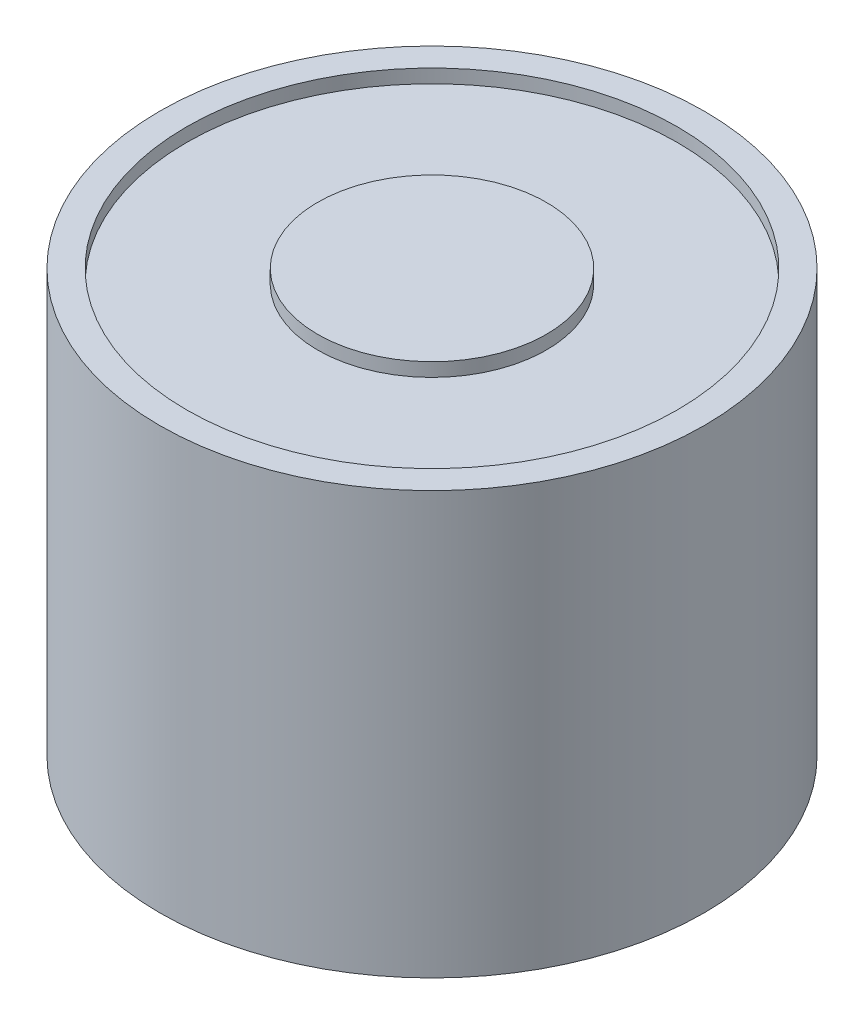
ISO-10303-21;
HEADER;
FILE_DESCRIPTION(('STEP AP214'),'2;1');
FILE_NAME('part.step','',(''),(''),'','','');
FILE_SCHEMA(('AUTOMOTIVE_DESIGN { 1 0 10303 214 1 1 1 1 }'));
ENDSEC;
DATA;
#1=APPLICATION_CONTEXT('core data for automotive mechanical design processes');
#2=APPLICATION_PROTOCOL_DEFINITION('international standard','automotive_design',2000,#1);
#3=PRODUCT_CONTEXT('',#1,'mechanical');
#4=PRODUCT('Part','Part','',(#3));
#5=PRODUCT_RELATED_PRODUCT_CATEGORY('part','',(#4));
#6=PRODUCT_DEFINITION_FORMATION('','',#4);
#7=PRODUCT_DEFINITION_CONTEXT('part definition',#1,'design');
#8=PRODUCT_DEFINITION('design','',#6,#7);
#9=PRODUCT_DEFINITION_SHAPE('','',#8);
#10=(LENGTH_UNIT() NAMED_UNIT(*) SI_UNIT(.MILLI.,.METRE.));
#11=(NAMED_UNIT(*) PLANE_ANGLE_UNIT() SI_UNIT($,.RADIAN.));
#12=(NAMED_UNIT(*) SI_UNIT($,.STERADIAN.) SOLID_ANGLE_UNIT());
#13=UNCERTAINTY_MEASURE_WITH_UNIT(LENGTH_MEASURE(1.E-05),#10,'distance_accuracy_value','');
#14=(GEOMETRIC_REPRESENTATION_CONTEXT(3) GLOBAL_UNCERTAINTY_ASSIGNED_CONTEXT((#13)) GLOBAL_UNIT_ASSIGNED_CONTEXT((#10,
#11,#12)) REPRESENTATION_CONTEXT('',''));
#15=CARTESIAN_POINT('',(0.,0.,0.));
#16=DIRECTION('',(0.,0.,1.));
#17=DIRECTION('',(1.,0.,0.));
#18=AXIS2_PLACEMENT_3D('',#15,#16,#17);
#19=CARTESIAN_POINT('',(0.,15.,0.));
#20=DIRECTION('',(0.,-1.,0.));
#21=DIRECTION('',(0.,0.,-1.));
#22=AXIS2_PLACEMENT_3D('',#19,#20,#21);
#23=CYLINDRICAL_SURFACE('',#22,10.);
#24=CARTESIAN_POINT('',(0.,0.,0.));
#25=DIRECTION('',(0.,1.,0.));
#26=DIRECTION('',(0.,0.,1.));
#27=AXIS2_PLACEMENT_3D('',#24,#25,#26);
#28=CIRCLE('',#27,10.);
#29=CARTESIAN_POINT('',(0.,0.,10.));
#30=VERTEX_POINT('',#29);
#31=EDGE_CURVE('E40',#30,#30,#28,.T.);
#32=ORIENTED_EDGE('',*,*,#31,.T.);
#33=EDGE_LOOP('',(#32));
#34=FACE_BOUND('',#33,.T.);
#35=CARTESIAN_POINT('',(0.,15.5,0.));
#36=DIRECTION('',(0.,1.,0.));
#37=DIRECTION('',(0.,0.,1.));
#38=AXIS2_PLACEMENT_3D('',#35,#36,#37);
#39=CIRCLE('',#38,10.);
#40=CARTESIAN_POINT('',(0.,15.5,10.));
#41=VERTEX_POINT('',#40);
#42=EDGE_CURVE('E44',#41,#41,#39,.T.);
#43=ORIENTED_EDGE('',*,*,#42,.F.);
#44=EDGE_LOOP('',(#43));
#45=FACE_BOUND('',#44,.T.);
#46=ADVANCED_FACE('F34',(#34,#45),#23,.T.);
#47=CARTESIAN_POINT('',(0.,0.,0.));
#48=DIRECTION('',(0.,1.,0.));
#49=DIRECTION('',(0.,0.,1.));
#50=AXIS2_PLACEMENT_3D('',#47,#48,#49);
#51=PLANE('',#50);
#52=ORIENTED_EDGE('',*,*,#31,.F.);
#53=EDGE_LOOP('',(#52));
#54=FACE_BOUND('',#53,.T.);
#55=ADVANCED_FACE('F81',(#54),#51,.F.);
#56=CARTESIAN_POINT('',(0.,15.5,0.));
#57=DIRECTION('',(0.,1.,0.));
#58=DIRECTION('',(0.,0.,1.));
#59=AXIS2_PLACEMENT_3D('',#56,#57,#58);
#60=PLANE('',#59);
#61=ORIENTED_EDGE('',*,*,#42,.T.);
#62=EDGE_LOOP('',(#61));
#63=FACE_BOUND('',#62,.T.);
#64=CARTESIAN_POINT('',(0.,15.5,0.));
#65=DIRECTION('',(0.,1.,0.));
#66=DIRECTION('',(0.,0.,1.));
#67=AXIS2_PLACEMENT_3D('',#64,#65,#66);
#68=CIRCLE('',#67,9.00887790295114);
#69=CARTESIAN_POINT('',(0.,15.5,9.00887790295114));
#70=VERTEX_POINT('',#69);
#71=EDGE_CURVE('E48',#70,#70,#68,.T.);
#72=ORIENTED_EDGE('',*,*,#71,.F.);
#73=EDGE_LOOP('',(#72));
#74=FACE_BOUND('',#73,.T.);
#75=ADVANCED_FACE('F76',(#63,#74),#60,.T.);
#76=CARTESIAN_POINT('',(0.,15.5,0.));
#77=DIRECTION('',(0.,-1.,0.));
#78=DIRECTION('',(0.,0.,-1.));
#79=AXIS2_PLACEMENT_3D('',#76,#77,#78);
#80=CYLINDRICAL_SURFACE('',#79,9.00887790295114);
#81=ORIENTED_EDGE('',*,*,#71,.T.);
#82=EDGE_LOOP('',(#81));
#83=FACE_BOUND('',#82,.T.);
#84=CARTESIAN_POINT('',(0.,15.,0.));
#85=DIRECTION('',(0.,1.,0.));
#86=DIRECTION('',(0.,0.,1.));
#87=AXIS2_PLACEMENT_3D('',#84,#85,#86);
#88=CIRCLE('',#87,9.00887790295114);
#89=CARTESIAN_POINT('',(0.,15.,9.00887790295114));
#90=VERTEX_POINT('',#89);
#91=EDGE_CURVE('E10',#90,#90,#88,.F.);
#92=ORIENTED_EDGE('',*,*,#91,.T.);
#93=EDGE_LOOP('',(#92));
#94=FACE_BOUND('',#93,.T.);
#95=ADVANCED_FACE('F71',(#83,#94),#80,.F.);
#96=CARTESIAN_POINT('',(0.,15.,0.));
#97=DIRECTION('',(0.,1.,0.));
#98=DIRECTION('',(0.,0.,1.));
#99=AXIS2_PLACEMENT_3D('',#96,#97,#98);
#100=PLANE('',#99);
#101=CARTESIAN_POINT('',(0.,15.,0.));
#102=DIRECTION('',(0.,1.,0.));
#103=DIRECTION('',(0.,0.,1.));
#104=AXIS2_PLACEMENT_3D('',#101,#102,#103);
#105=CIRCLE('',#104,4.20114421588355);
#106=CARTESIAN_POINT('',(0.,15.,4.20114421588355));
#107=VERTEX_POINT('',#106);
#108=EDGE_CURVE('E54',#107,#107,#105,.T.);
#109=ORIENTED_EDGE('',*,*,#108,.F.);
#110=EDGE_LOOP('',(#109));
#111=FACE_BOUND('',#110,.T.);
#112=ORIENTED_EDGE('',*,*,#91,.F.);
#113=EDGE_LOOP('',(#112));
#114=FACE_BOUND('',#113,.T.);
#115=ADVANCED_FACE('F65',(#111,#114),#100,.T.);
#116=CARTESIAN_POINT('',(0.,15.5,0.));
#117=DIRECTION('',(0.,-1.,0.));
#118=DIRECTION('',(0.,0.,-1.));
#119=AXIS2_PLACEMENT_3D('',#116,#117,#118);
#120=CYLINDRICAL_SURFACE('',#119,4.20114421588355);
#121=CARTESIAN_POINT('',(0.,15.5,0.));
#122=DIRECTION('',(0.,1.,0.));
#123=DIRECTION('',(0.,0.,1.));
#124=AXIS2_PLACEMENT_3D('',#121,#122,#123);
#125=CIRCLE('',#124,4.20114421588355);
#126=CARTESIAN_POINT('',(0.,15.5,4.20114421588355));
#127=VERTEX_POINT('',#126);
#128=EDGE_CURVE('E53',#127,#127,#125,.T.);
#129=ORIENTED_EDGE('',*,*,#128,.F.);
#130=EDGE_LOOP('',(#129));
#131=FACE_BOUND('',#130,.T.);
#132=ORIENTED_EDGE('',*,*,#108,.T.);
#133=EDGE_LOOP('',(#132));
#134=FACE_BOUND('',#133,.T.);
#135=ADVANCED_FACE('F62',(#131,#134),#120,.T.);
#136=CARTESIAN_POINT('',(0.,15.5,0.));
#137=DIRECTION('',(0.,1.,0.));
#138=DIRECTION('',(0.,0.,1.));
#139=AXIS2_PLACEMENT_3D('',#136,#137,#138);
#140=PLANE('',#139);
#141=ORIENTED_EDGE('',*,*,#128,.T.);
#142=EDGE_LOOP('',(#141));
#143=FACE_BOUND('',#142,.T.);
#144=ADVANCED_FACE('F60',(#143),#140,.T.);
#145=CLOSED_SHELL('',(#46,#55,#75,#95,#115,#135,#144));
#146=MANIFOLD_SOLID_BREP('B2',#145);
#147=ADVANCED_BREP_SHAPE_REPRESENTATION('',(#18,#146),#14);
#148=SHAPE_DEFINITION_REPRESENTATION(#9,#147);
ENDSEC;
END-ISO-10303-21;
